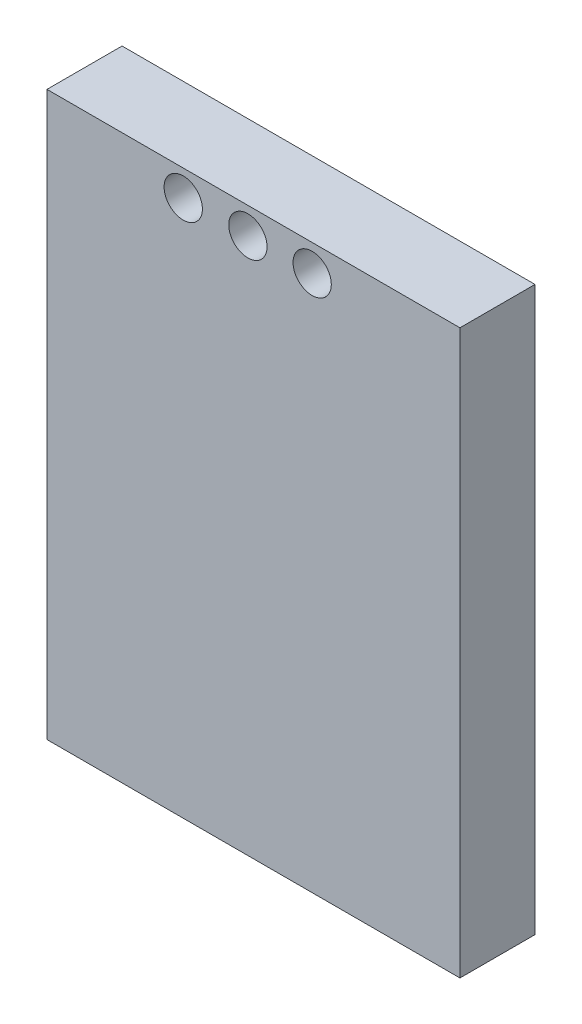
ISO-10303-21;
HEADER;
FILE_DESCRIPTION(('STEP AP214'),'2;1');
FILE_NAME('part.step','',(''),(''),'','','');
FILE_SCHEMA(('AUTOMOTIVE_DESIGN { 1 0 10303 214 1 1 1 1 }'));
ENDSEC;
DATA;
#1=APPLICATION_CONTEXT('core data for automotive mechanical design processes');
#2=APPLICATION_PROTOCOL_DEFINITION('international standard','automotive_design',2000,#1);
#3=PRODUCT_CONTEXT('',#1,'mechanical');
#4=PRODUCT('Part','Part','',(#3));
#5=PRODUCT_RELATED_PRODUCT_CATEGORY('part','',(#4));
#6=PRODUCT_DEFINITION_FORMATION('','',#4);
#7=PRODUCT_DEFINITION_CONTEXT('part definition',#1,'design');
#8=PRODUCT_DEFINITION('design','',#6,#7);
#9=PRODUCT_DEFINITION_SHAPE('','',#8);
#10=(LENGTH_UNIT() NAMED_UNIT(*) SI_UNIT(.MILLI.,.METRE.));
#11=(NAMED_UNIT(*) PLANE_ANGLE_UNIT() SI_UNIT($,.RADIAN.));
#12=(NAMED_UNIT(*) SI_UNIT($,.STERADIAN.) SOLID_ANGLE_UNIT());
#13=UNCERTAINTY_MEASURE_WITH_UNIT(LENGTH_MEASURE(1.E-05),#10,'distance_accuracy_value','');
#14=(GEOMETRIC_REPRESENTATION_CONTEXT(3) GLOBAL_UNCERTAINTY_ASSIGNED_CONTEXT((#13)) GLOBAL_UNIT_ASSIGNED_CONTEXT((#10,
#11,#12)) REPRESENTATION_CONTEXT('',''));
#15=CARTESIAN_POINT('',(0.,0.,0.));
#16=DIRECTION('',(0.,0.,1.));
#17=DIRECTION('',(1.,0.,0.));
#18=AXIS2_PLACEMENT_3D('',#15,#16,#17);
#19=CARTESIAN_POINT('',(5.5,7.5,2.));
#20=DIRECTION('',(-1.,0.,0.));
#21=DIRECTION('',(0.,-1.,0.));
#22=AXIS2_PLACEMENT_3D('',#19,#20,#21);
#23=PLANE('',#22);
#24=DIRECTION('',(0.,1.,0.));
#25=VECTOR('',#24,1.);
#26=CARTESIAN_POINT('',(5.5,7.5,0.));
#27=LINE('',#26,#25);
#28=CARTESIAN_POINT('',(5.5,-7.5,0.));
#29=VERTEX_POINT('',#28);
#30=CARTESIAN_POINT('',(5.5,7.5,0.));
#31=VERTEX_POINT('',#30);
#32=EDGE_CURVE('E102',#29,#31,#27,.T.);
#33=ORIENTED_EDGE('',*,*,#32,.T.);
#34=DIRECTION('',(0.,0.,-1.));
#35=VECTOR('',#34,1.);
#36=CARTESIAN_POINT('',(5.5,7.5,2.));
#37=LINE('',#36,#35);
#38=CARTESIAN_POINT('',(5.5,7.5,2.));
#39=VERTEX_POINT('',#38);
#40=EDGE_CURVE('E11',#39,#31,#37,.T.);
#41=ORIENTED_EDGE('',*,*,#40,.F.);
#42=DIRECTION('',(0.,1.,0.));
#43=VECTOR('',#42,1.);
#44=CARTESIAN_POINT('',(5.5,7.5,2.));
#45=LINE('',#44,#43);
#46=CARTESIAN_POINT('',(5.5,-7.5,2.));
#47=VERTEX_POINT('',#46);
#48=EDGE_CURVE('E90',#47,#39,#45,.T.);
#49=ORIENTED_EDGE('',*,*,#48,.F.);
#50=DIRECTION('',(0.,0.,-1.));
#51=VECTOR('',#50,1.);
#52=CARTESIAN_POINT('',(5.5,-7.5,2.));
#53=LINE('',#52,#51);
#54=EDGE_CURVE('E98',#47,#29,#53,.T.);
#55=ORIENTED_EDGE('',*,*,#54,.T.);
#56=EDGE_LOOP('',(#33,#41,#49,#55));
#57=FACE_BOUND('',#56,.T.);
#58=ADVANCED_FACE('F39',(#57),#23,.F.);
#59=CARTESIAN_POINT('',(-5.5,7.5,2.));
#60=DIRECTION('',(0.,-1.,0.));
#61=DIRECTION('',(0.,0.,-1.));
#62=AXIS2_PLACEMENT_3D('',#59,#60,#61);
#63=PLANE('',#62);
#64=DIRECTION('',(-1.,0.,0.));
#65=VECTOR('',#64,1.);
#66=CARTESIAN_POINT('',(-5.5,7.5,0.));
#67=LINE('',#66,#65);
#68=CARTESIAN_POINT('',(-5.5,7.5,0.));
#69=VERTEX_POINT('',#68);
#70=EDGE_CURVE('E94',#31,#69,#67,.T.);
#71=ORIENTED_EDGE('',*,*,#70,.T.);
#72=DIRECTION('',(0.,0.,-1.));
#73=VECTOR('',#72,1.);
#74=CARTESIAN_POINT('',(-5.5,7.5,2.));
#75=LINE('',#74,#73);
#76=CARTESIAN_POINT('',(-5.5,7.5,2.));
#77=VERTEX_POINT('',#76);
#78=EDGE_CURVE('E47',#77,#69,#75,.T.);
#79=ORIENTED_EDGE('',*,*,#78,.F.);
#80=DIRECTION('',(-1.,0.,0.));
#81=VECTOR('',#80,1.);
#82=CARTESIAN_POINT('',(-5.5,7.5,2.));
#83=LINE('',#82,#81);
#84=EDGE_CURVE('E85',#39,#77,#83,.T.);
#85=ORIENTED_EDGE('',*,*,#84,.F.);
#86=ORIENTED_EDGE('',*,*,#40,.T.);
#87=EDGE_LOOP('',(#71,#79,#85,#86));
#88=FACE_BOUND('',#87,.T.);
#89=ADVANCED_FACE('F93',(#88),#63,.F.);
#90=CARTESIAN_POINT('',(-5.5,7.5,2.));
#91=DIRECTION('',(1.,0.,0.));
#92=DIRECTION('',(0.,1.,0.));
#93=AXIS2_PLACEMENT_3D('',#90,#91,#92);
#94=PLANE('',#93);
#95=DIRECTION('',(0.,-1.,0.));
#96=VECTOR('',#95,1.);
#97=CARTESIAN_POINT('',(-5.5,7.5,0.));
#98=LINE('',#97,#96);
#99=CARTESIAN_POINT('',(-5.5,-7.5,0.));
#100=VERTEX_POINT('',#99);
#101=EDGE_CURVE('E72',#69,#100,#98,.T.);
#102=ORIENTED_EDGE('',*,*,#101,.T.);
#103=DIRECTION('',(0.,0.,-1.));
#104=VECTOR('',#103,1.);
#105=CARTESIAN_POINT('',(-5.5,-7.5,2.));
#106=LINE('',#105,#104);
#107=CARTESIAN_POINT('',(-5.5,-7.5,2.));
#108=VERTEX_POINT('',#107);
#109=EDGE_CURVE('E95',#108,#100,#106,.T.);
#110=ORIENTED_EDGE('',*,*,#109,.F.);
#111=DIRECTION('',(0.,-1.,0.));
#112=VECTOR('',#111,1.);
#113=CARTESIAN_POINT('',(-5.5,7.5,2.));
#114=LINE('',#113,#112);
#115=EDGE_CURVE('E88',#77,#108,#114,.T.);
#116=ORIENTED_EDGE('',*,*,#115,.F.);
#117=ORIENTED_EDGE('',*,*,#78,.T.);
#118=EDGE_LOOP('',(#102,#110,#116,#117));
#119=FACE_BOUND('',#118,.T.);
#120=ADVANCED_FACE('F96',(#119),#94,.F.);
#121=CARTESIAN_POINT('',(-5.5,-7.5,2.));
#122=DIRECTION('',(0.,1.,0.));
#123=DIRECTION('',(0.,0.,1.));
#124=AXIS2_PLACEMENT_3D('',#121,#122,#123);
#125=PLANE('',#124);
#126=DIRECTION('',(1.,0.,0.));
#127=VECTOR('',#126,1.);
#128=CARTESIAN_POINT('',(-5.5,-7.5,0.));
#129=LINE('',#128,#127);
#130=EDGE_CURVE('E78',#100,#29,#129,.T.);
#131=ORIENTED_EDGE('',*,*,#130,.T.);
#132=ORIENTED_EDGE('',*,*,#54,.F.);
#133=DIRECTION('',(1.,0.,0.));
#134=VECTOR('',#133,1.);
#135=CARTESIAN_POINT('',(-5.5,-7.5,2.));
#136=LINE('',#135,#134);
#137=EDGE_CURVE('E55',#108,#47,#136,.T.);
#138=ORIENTED_EDGE('',*,*,#137,.F.);
#139=ORIENTED_EDGE('',*,*,#109,.T.);
#140=EDGE_LOOP('',(#131,#132,#138,#139));
#141=FACE_BOUND('',#140,.T.);
#142=ADVANCED_FACE('F110',(#141),#125,.F.);
#143=CARTESIAN_POINT('',(0.,0.,2.));
#144=DIRECTION('',(0.,0.,1.));
#145=DIRECTION('',(1.,0.,0.));
#146=AXIS2_PLACEMENT_3D('',#143,#144,#145);
#147=PLANE('',#146);
#148=CARTESIAN_POINT('',(-1.8706337264483,6.80834451416566,2.));
#149=DIRECTION('',(0.,0.,1.));
#150=DIRECTION('',(1.,0.,0.));
#151=AXIS2_PLACEMENT_3D('',#148,#149,#150);
#152=CIRCLE('',#151,0.510041948057849);
#153=CARTESIAN_POINT('',(-1.36059177839045,6.80834451416566,2.));
#154=VERTEX_POINT('',#153);
#155=EDGE_CURVE('E128',#154,#154,#152,.T.);
#156=ORIENTED_EDGE('',*,*,#155,.F.);
#157=EDGE_LOOP('',(#156));
#158=FACE_BOUND('',#157,.T.);
#159=CARTESIAN_POINT('',(-0.147825368564005,6.79701024865326,2.));
#160=DIRECTION('',(0.,0.,1.));
#161=DIRECTION('',(1.,0.,0.));
#162=AXIS2_PLACEMENT_3D('',#159,#160,#161);
#163=CIRCLE('',#162,0.510041948057849);
#164=CARTESIAN_POINT('',(0.362216579493844,6.79701024865326,2.));
#165=VERTEX_POINT('',#164);
#166=EDGE_CURVE('E122',#165,#165,#163,.T.);
#167=ORIENTED_EDGE('',*,*,#166,.F.);
#168=EDGE_LOOP('',(#167));
#169=FACE_BOUND('',#168,.T.);
#170=CARTESIAN_POINT('',(1.56364872380789,6.78567598314086,2.));
#171=DIRECTION('',(0.,0.,1.));
#172=DIRECTION('',(1.,0.,0.));
#173=AXIS2_PLACEMENT_3D('',#170,#171,#172);
#174=CIRCLE('',#173,0.510041948057849);
#175=CARTESIAN_POINT('',(2.07369067186574,6.78567598314086,2.));
#176=VERTEX_POINT('',#175);
#177=EDGE_CURVE('E116',#176,#176,#174,.T.);
#178=ORIENTED_EDGE('',*,*,#177,.F.);
#179=EDGE_LOOP('',(#178));
#180=FACE_BOUND('',#179,.T.);
#181=ORIENTED_EDGE('',*,*,#48,.T.);
#182=ORIENTED_EDGE('',*,*,#84,.T.);
#183=ORIENTED_EDGE('',*,*,#115,.T.);
#184=ORIENTED_EDGE('',*,*,#137,.T.);
#185=EDGE_LOOP('',(#181,#182,#183,#184));
#186=FACE_BOUND('',#185,.T.);
#187=ADVANCED_FACE('F86',(#158,#169,#180,#186),#147,.T.);
#188=CARTESIAN_POINT('',(0.,0.,0.));
#189=DIRECTION('',(0.,0.,1.));
#190=DIRECTION('',(1.,0.,0.));
#191=AXIS2_PLACEMENT_3D('',#188,#189,#190);
#192=PLANE('',#191);
#193=CARTESIAN_POINT('',(-1.8706337264483,6.80834451416566,0.));
#194=DIRECTION('',(0.,0.,1.));
#195=DIRECTION('',(1.,0.,0.));
#196=AXIS2_PLACEMENT_3D('',#193,#194,#195);
#197=CIRCLE('',#196,0.510041948057849);
#198=CARTESIAN_POINT('',(-1.36059177839045,6.80834451416566,0.));
#199=VERTEX_POINT('',#198);
#200=EDGE_CURVE('E105',#199,#199,#197,.T.);
#201=ORIENTED_EDGE('',*,*,#200,.T.);
#202=EDGE_LOOP('',(#201));
#203=FACE_BOUND('',#202,.T.);
#204=CARTESIAN_POINT('',(-0.147825368564005,6.79701024865326,0.));
#205=DIRECTION('',(0.,0.,1.));
#206=DIRECTION('',(1.,0.,0.));
#207=AXIS2_PLACEMENT_3D('',#204,#205,#206);
#208=CIRCLE('',#207,0.510041948057849);
#209=CARTESIAN_POINT('',(0.362216579493844,6.79701024865326,0.));
#210=VERTEX_POINT('',#209);
#211=EDGE_CURVE('E125',#210,#210,#208,.T.);
#212=ORIENTED_EDGE('',*,*,#211,.T.);
#213=EDGE_LOOP('',(#212));
#214=FACE_BOUND('',#213,.T.);
#215=CARTESIAN_POINT('',(1.56364872380789,6.78567598314086,0.));
#216=DIRECTION('',(0.,0.,1.));
#217=DIRECTION('',(1.,0.,0.));
#218=AXIS2_PLACEMENT_3D('',#215,#216,#217);
#219=CIRCLE('',#218,0.510041948057849);
#220=CARTESIAN_POINT('',(2.07369067186574,6.78567598314086,0.));
#221=VERTEX_POINT('',#220);
#222=EDGE_CURVE('E119',#221,#221,#219,.T.);
#223=ORIENTED_EDGE('',*,*,#222,.T.);
#224=EDGE_LOOP('',(#223));
#225=FACE_BOUND('',#224,.T.);
#226=ORIENTED_EDGE('',*,*,#32,.F.);
#227=ORIENTED_EDGE('',*,*,#130,.F.);
#228=ORIENTED_EDGE('',*,*,#101,.F.);
#229=ORIENTED_EDGE('',*,*,#70,.F.);
#230=EDGE_LOOP('',(#226,#227,#228,#229));
#231=FACE_BOUND('',#230,.T.);
#232=ADVANCED_FACE('F113',(#203,#214,#225,#231),#192,.F.);
#233=CARTESIAN_POINT('',(1.56364872380789,6.78567598314086,0.));
#234=DIRECTION('',(0.,0.,1.));
#235=DIRECTION('',(1.,0.,0.));
#236=AXIS2_PLACEMENT_3D('',#233,#234,#235);
#237=CYLINDRICAL_SURFACE('',#236,0.510041948057849);
#238=ORIENTED_EDGE('',*,*,#222,.F.);
#239=EDGE_LOOP('',(#238));
#240=FACE_BOUND('',#239,.T.);
#241=ORIENTED_EDGE('',*,*,#177,.T.);
#242=EDGE_LOOP('',(#241));
#243=FACE_BOUND('',#242,.T.);
#244=ADVANCED_FACE('F150',(#240,#243),#237,.F.);
#245=CARTESIAN_POINT('',(-0.147825368564005,6.79701024865326,0.));
#246=DIRECTION('',(0.,0.,1.));
#247=DIRECTION('',(1.,0.,0.));
#248=AXIS2_PLACEMENT_3D('',#245,#246,#247);
#249=CYLINDRICAL_SURFACE('',#248,0.510041948057849);
#250=ORIENTED_EDGE('',*,*,#211,.F.);
#251=EDGE_LOOP('',(#250));
#252=FACE_BOUND('',#251,.T.);
#253=ORIENTED_EDGE('',*,*,#166,.T.);
#254=EDGE_LOOP('',(#253));
#255=FACE_BOUND('',#254,.T.);
#256=ADVANCED_FACE('F139',(#252,#255),#249,.F.);
#257=CARTESIAN_POINT('',(-1.8706337264483,6.80834451416566,0.));
#258=DIRECTION('',(0.,0.,1.));
#259=DIRECTION('',(1.,0.,0.));
#260=AXIS2_PLACEMENT_3D('',#257,#258,#259);
#261=CYLINDRICAL_SURFACE('',#260,0.510041948057849);
#262=ORIENTED_EDGE('',*,*,#200,.F.);
#263=EDGE_LOOP('',(#262));
#264=FACE_BOUND('',#263,.T.);
#265=ORIENTED_EDGE('',*,*,#155,.T.);
#266=EDGE_LOOP('',(#265));
#267=FACE_BOUND('',#266,.T.);
#268=ADVANCED_FACE('F136',(#264,#267),#261,.F.);
#269=CLOSED_SHELL('',(#58,#89,#120,#142,#187,#232,#244,#256,#268));
#270=MANIFOLD_SOLID_BREP('B2',#269);
#271=ADVANCED_BREP_SHAPE_REPRESENTATION('',(#18,#270),#14);
#272=SHAPE_DEFINITION_REPRESENTATION(#9,#271);
ENDSEC;
END-ISO-10303-21;
